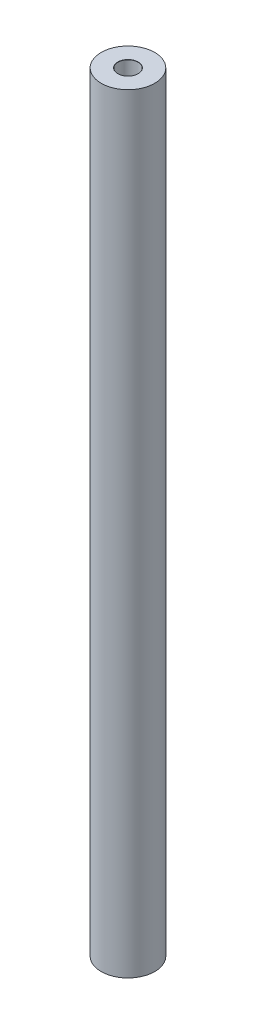
ISO-10303-21;
HEADER;
FILE_DESCRIPTION(('STEP AP214'),'2;1');
FILE_NAME('part.step','',(''),(''),'','','');
FILE_SCHEMA(('AUTOMOTIVE_DESIGN { 1 0 10303 214 1 1 1 1 }'));
ENDSEC;
DATA;
#1=APPLICATION_CONTEXT('core data for automotive mechanical design processes');
#2=APPLICATION_PROTOCOL_DEFINITION('international standard','automotive_design',2000,#1);
#3=PRODUCT_CONTEXT('',#1,'mechanical');
#4=PRODUCT('Part','Part','',(#3));
#5=PRODUCT_RELATED_PRODUCT_CATEGORY('part','',(#4));
#6=PRODUCT_DEFINITION_FORMATION('','',#4);
#7=PRODUCT_DEFINITION_CONTEXT('part definition',#1,'design');
#8=PRODUCT_DEFINITION('design','',#6,#7);
#9=PRODUCT_DEFINITION_SHAPE('','',#8);
#10=(LENGTH_UNIT() NAMED_UNIT(*) SI_UNIT(.MILLI.,.METRE.));
#11=(NAMED_UNIT(*) PLANE_ANGLE_UNIT() SI_UNIT($,.RADIAN.));
#12=(NAMED_UNIT(*) SI_UNIT($,.STERADIAN.) SOLID_ANGLE_UNIT());
#13=UNCERTAINTY_MEASURE_WITH_UNIT(LENGTH_MEASURE(1.E-05),#10,'distance_accuracy_value','');
#14=(GEOMETRIC_REPRESENTATION_CONTEXT(3) GLOBAL_UNCERTAINTY_ASSIGNED_CONTEXT((#13)) GLOBAL_UNIT_ASSIGNED_CONTEXT((#10,
#11,#12)) REPRESENTATION_CONTEXT('',''));
#15=CARTESIAN_POINT('',(0.,0.,0.));
#16=DIRECTION('',(0.,0.,1.));
#17=DIRECTION('',(1.,0.,0.));
#18=AXIS2_PLACEMENT_3D('',#15,#16,#17);
#19=CARTESIAN_POINT('',(0.,115.,0.));
#20=DIRECTION('',(0.,-1.,0.));
#21=DIRECTION('',(0.,0.,-1.));
#22=AXIS2_PLACEMENT_3D('',#19,#20,#21);
#23=CYLINDRICAL_SURFACE('',#22,4.);
#24=CARTESIAN_POINT('',(0.,115.,0.));
#25=DIRECTION('',(0.,1.,0.));
#26=DIRECTION('',(0.,0.,1.));
#27=AXIS2_PLACEMENT_3D('',#24,#25,#26);
#28=CIRCLE('',#27,4.);
#29=CARTESIAN_POINT('',(0.,115.,4.));
#30=VERTEX_POINT('',#29);
#31=EDGE_CURVE('E11',#30,#30,#28,.T.);
#32=ORIENTED_EDGE('',*,*,#31,.F.);
#33=EDGE_LOOP('',(#32));
#34=FACE_BOUND('',#33,.T.);
#35=CARTESIAN_POINT('',(0.,0.,0.));
#36=DIRECTION('',(0.,1.,0.));
#37=DIRECTION('',(0.,0.,1.));
#38=AXIS2_PLACEMENT_3D('',#35,#36,#37);
#39=CIRCLE('',#38,4.);
#40=CARTESIAN_POINT('',(0.,0.,4.));
#41=VERTEX_POINT('',#40);
#42=EDGE_CURVE('E48',#41,#41,#39,.T.);
#43=ORIENTED_EDGE('',*,*,#42,.T.);
#44=EDGE_LOOP('',(#43));
#45=FACE_BOUND('',#44,.T.);
#46=ADVANCED_FACE('F45',(#34,#45),#23,.T.);
#47=CARTESIAN_POINT('',(0.,115.,0.));
#48=DIRECTION('',(0.,1.,0.));
#49=DIRECTION('',(0.,0.,1.));
#50=AXIS2_PLACEMENT_3D('',#47,#48,#49);
#51=PLANE('',#50);
#52=CARTESIAN_POINT('',(0.,115.,0.));
#53=DIRECTION('',(0.,1.,0.));
#54=DIRECTION('',(0.,0.,1.));
#55=AXIS2_PLACEMENT_3D('',#52,#53,#54);
#56=CIRCLE('',#55,1.525);
#57=CARTESIAN_POINT('',(0.,115.,1.525));
#58=VERTEX_POINT('',#57);
#59=EDGE_CURVE('E70',#58,#58,#56,.T.);
#60=ORIENTED_EDGE('',*,*,#59,.F.);
#61=EDGE_LOOP('',(#60));
#62=FACE_BOUND('',#61,.T.);
#63=ORIENTED_EDGE('',*,*,#31,.T.);
#64=EDGE_LOOP('',(#63));
#65=FACE_BOUND('',#64,.T.);
#66=ADVANCED_FACE('F99',(#62,#65),#51,.T.);
#67=CARTESIAN_POINT('',(0.,0.,0.));
#68=DIRECTION('',(0.,1.,0.));
#69=DIRECTION('',(0.,0.,1.));
#70=AXIS2_PLACEMENT_3D('',#67,#68,#69);
#71=PLANE('',#70);
#72=CARTESIAN_POINT('',(0.,0.,0.));
#73=DIRECTION('',(0.,-1.,0.));
#74=DIRECTION('',(0.,0.,-1.));
#75=AXIS2_PLACEMENT_3D('',#72,#73,#74);
#76=CIRCLE('',#75,1.525);
#77=CARTESIAN_POINT('',(0.,0.,-1.525));
#78=VERTEX_POINT('',#77);
#79=EDGE_CURVE('E79',#78,#78,#76,.T.);
#80=ORIENTED_EDGE('',*,*,#79,.F.);
#81=EDGE_LOOP('',(#80));
#82=FACE_BOUND('',#81,.T.);
#83=ORIENTED_EDGE('',*,*,#42,.F.);
#84=EDGE_LOOP('',(#83));
#85=FACE_BOUND('',#84,.T.);
#86=ADVANCED_FACE('F96',(#82,#85),#71,.F.);
#87=CARTESIAN_POINT('',(0.,100.,0.));
#88=DIRECTION('',(0.,1.,0.));
#89=DIRECTION('',(0.,0.,1.));
#90=AXIS2_PLACEMENT_3D('',#87,#88,#89);
#91=CONICAL_SURFACE('',#90,1.5,1.02974425867665);
#92=CARTESIAN_POINT('',(0.,99.0987090714587,0.));
#93=VERTEX_POINT('',#92);
#94=VERTEX_LOOP('',#93);
#95=FACE_BOUND('',#94,.T.);
#96=CARTESIAN_POINT('',(0.,100.,0.));
#97=DIRECTION('',(0.,1.,0.));
#98=DIRECTION('',(0.,0.,1.));
#99=AXIS2_PLACEMENT_3D('',#96,#97,#98);
#100=CIRCLE('',#99,1.5);
#101=CARTESIAN_POINT('',(0.,100.,1.5));
#102=VERTEX_POINT('',#101);
#103=EDGE_CURVE('E86',#102,#102,#100,.T.);
#104=ORIENTED_EDGE('',*,*,#103,.T.);
#105=EDGE_LOOP('',(#104));
#106=FACE_BOUND('',#105,.T.);
#107=ADVANCED_FACE('F98',(#95,#106),#91,.F.);
#108=CARTESIAN_POINT('',(0.,115.,0.));
#109=DIRECTION('',(0.,1.,0.));
#110=DIRECTION('',(0.,0.,1.));
#111=AXIS2_PLACEMENT_3D('',#108,#109,#110);
#112=CYLINDRICAL_SURFACE('',#111,1.5);
#113=ORIENTED_EDGE('',*,*,#103,.F.);
#114=EDGE_LOOP('',(#113));
#115=FACE_BOUND('',#114,.T.);
#116=CARTESIAN_POINT('',(0.,114.975,0.));
#117=DIRECTION('',(0.,1.,0.));
#118=DIRECTION('',(0.,0.,1.));
#119=AXIS2_PLACEMENT_3D('',#116,#117,#118);
#120=CIRCLE('',#119,1.5);
#121=CARTESIAN_POINT('',(0.,114.975,1.5));
#122=VERTEX_POINT('',#121);
#123=EDGE_CURVE('E76',#122,#122,#120,.T.);
#124=ORIENTED_EDGE('',*,*,#123,.T.);
#125=EDGE_LOOP('',(#124));
#126=FACE_BOUND('',#125,.T.);
#127=ADVANCED_FACE('F105',(#115,#126),#112,.F.);
#128=CARTESIAN_POINT('',(0.,115.,0.));
#129=DIRECTION('',(0.,1.,0.));
#130=DIRECTION('',(0.,0.,1.));
#131=AXIS2_PLACEMENT_3D('',#128,#129,#130);
#132=CONICAL_SURFACE('',#131,1.525,0.785398163397539);
#133=ORIENTED_EDGE('',*,*,#123,.F.);
#134=EDGE_LOOP('',(#133));
#135=FACE_BOUND('',#134,.T.);
#136=ORIENTED_EDGE('',*,*,#59,.T.);
#137=EDGE_LOOP('',(#136));
#138=FACE_BOUND('',#137,.T.);
#139=ADVANCED_FACE('F63',(#135,#138),#132,.F.);
#140=CARTESIAN_POINT('',(0.,15.,0.));
#141=DIRECTION('',(0.,-1.,0.));
#142=DIRECTION('',(0.,0.,-1.));
#143=AXIS2_PLACEMENT_3D('',#140,#141,#142);
#144=CONICAL_SURFACE('',#143,1.5,1.02974425867665);
#145=CARTESIAN_POINT('',(0.,15.9012909285413,0.));
#146=VERTEX_POINT('',#145);
#147=VERTEX_LOOP('',#146);
#148=FACE_BOUND('',#147,.T.);
#149=CARTESIAN_POINT('',(0.,15.,0.));
#150=DIRECTION('',(0.,-1.,0.));
#151=DIRECTION('',(0.,0.,-1.));
#152=AXIS2_PLACEMENT_3D('',#149,#150,#151);
#153=CIRCLE('',#152,1.5);
#154=CARTESIAN_POINT('',(0.,15.,-1.5));
#155=VERTEX_POINT('',#154);
#156=EDGE_CURVE('E67',#155,#155,#153,.T.);
#157=ORIENTED_EDGE('',*,*,#156,.T.);
#158=EDGE_LOOP('',(#157));
#159=FACE_BOUND('',#158,.T.);
#160=ADVANCED_FACE('F59',(#148,#159),#144,.F.);
#161=CARTESIAN_POINT('',(0.,0.,0.));
#162=DIRECTION('',(0.,-1.,0.));
#163=DIRECTION('',(0.,0.,-1.));
#164=AXIS2_PLACEMENT_3D('',#161,#162,#163);
#165=CYLINDRICAL_SURFACE('',#164,1.5);
#166=ORIENTED_EDGE('',*,*,#156,.F.);
#167=EDGE_LOOP('',(#166));
#168=FACE_BOUND('',#167,.T.);
#169=CARTESIAN_POINT('',(0.,0.0250000000000025,0.));
#170=DIRECTION('',(0.,-1.,0.));
#171=DIRECTION('',(0.,0.,-1.));
#172=AXIS2_PLACEMENT_3D('',#169,#170,#171);
#173=CIRCLE('',#172,1.5);
#174=CARTESIAN_POINT('',(0.,0.0250000000000025,-1.5));
#175=VERTEX_POINT('',#174);
#176=EDGE_CURVE('E71',#175,#175,#173,.T.);
#177=ORIENTED_EDGE('',*,*,#176,.T.);
#178=EDGE_LOOP('',(#177));
#179=FACE_BOUND('',#178,.T.);
#180=ADVANCED_FACE('F62',(#168,#179),#165,.F.);
#181=CARTESIAN_POINT('',(0.,0.,0.));
#182=DIRECTION('',(0.,-1.,0.));
#183=DIRECTION('',(0.,0.,-1.));
#184=AXIS2_PLACEMENT_3D('',#181,#182,#183);
#185=CONICAL_SURFACE('',#184,1.525,0.785398163397435);
#186=ORIENTED_EDGE('',*,*,#176,.F.);
#187=EDGE_LOOP('',(#186));
#188=FACE_BOUND('',#187,.T.);
#189=ORIENTED_EDGE('',*,*,#79,.T.);
#190=EDGE_LOOP('',(#189));
#191=FACE_BOUND('',#190,.T.);
#192=ADVANCED_FACE('F163',(#188,#191),#185,.F.);
#193=CLOSED_SHELL('',(#46,#66,#86,#107,#127,#139,#160,#180,#192));
#194=MANIFOLD_SOLID_BREP('B2',#193);
#195=ADVANCED_BREP_SHAPE_REPRESENTATION('',(#18,#194),#14);
#196=SHAPE_DEFINITION_REPRESENTATION(#9,#195);
ENDSEC;
END-ISO-10303-21;
